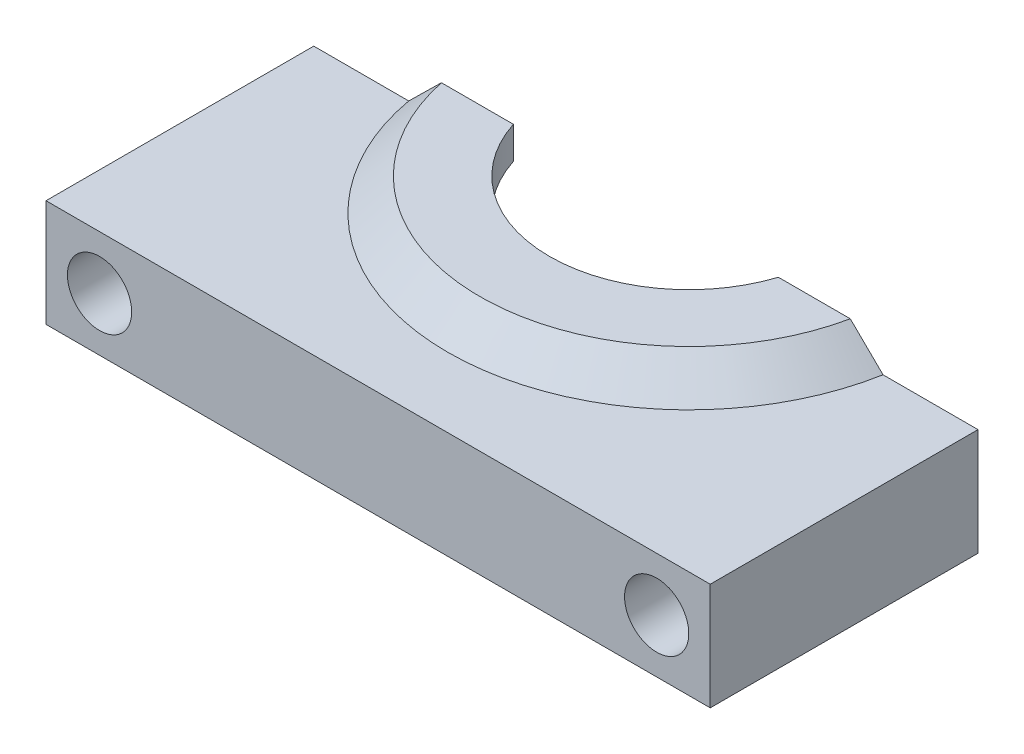
ISO-10303-21;
HEADER;
FILE_DESCRIPTION(('STEP AP214'),'2;1');
FILE_NAME('part.step','',(''),(''),'','','');
FILE_SCHEMA(('AUTOMOTIVE_DESIGN { 1 0 10303 214 1 1 1 1 }'));
ENDSEC;
DATA;
#1=APPLICATION_CONTEXT('core data for automotive mechanical design processes');
#2=APPLICATION_PROTOCOL_DEFINITION('international standard','automotive_design',2000,#1);
#3=PRODUCT_CONTEXT('',#1,'mechanical');
#4=PRODUCT('Part','Part','',(#3));
#5=PRODUCT_RELATED_PRODUCT_CATEGORY('part','',(#4));
#6=PRODUCT_DEFINITION_FORMATION('','',#4);
#7=PRODUCT_DEFINITION_CONTEXT('part definition',#1,'design');
#8=PRODUCT_DEFINITION('design','',#6,#7);
#9=PRODUCT_DEFINITION_SHAPE('','',#8);
#10=(LENGTH_UNIT() NAMED_UNIT(*) SI_UNIT(.MILLI.,.METRE.));
#11=(NAMED_UNIT(*) PLANE_ANGLE_UNIT() SI_UNIT($,.RADIAN.));
#12=(NAMED_UNIT(*) SI_UNIT($,.STERADIAN.) SOLID_ANGLE_UNIT());
#13=UNCERTAINTY_MEASURE_WITH_UNIT(LENGTH_MEASURE(1.E-05),#10,'distance_accuracy_value','');
#14=(GEOMETRIC_REPRESENTATION_CONTEXT(3) GLOBAL_UNCERTAINTY_ASSIGNED_CONTEXT((#13)) GLOBAL_UNIT_ASSIGNED_CONTEXT((#10,
#11,#12)) REPRESENTATION_CONTEXT('',''));
#15=CARTESIAN_POINT('',(0.,0.,0.));
#16=DIRECTION('',(0.,0.,1.));
#17=DIRECTION('',(1.,0.,0.));
#18=AXIS2_PLACEMENT_3D('',#15,#16,#17);
#19=CARTESIAN_POINT('',(31.0078105935821,10.,29.));
#20=DIRECTION('',(0.,0.,-1.));
#21=DIRECTION('',(-1.,0.,0.));
#22=AXIS2_PLACEMENT_3D('',#19,#20,#21);
#23=PLANE('',#22);
#24=CARTESIAN_POINT('',(26.0078105935821,5.,29.));
#25=DIRECTION('',(0.,0.,-1.));
#26=DIRECTION('',(-1.,0.,0.));
#27=AXIS2_PLACEMENT_3D('',#24,#25,#26);
#28=CIRCLE('',#27,3.);
#29=CARTESIAN_POINT('',(23.0078105935821,5.,29.));
#30=VERTEX_POINT('',#29);
#31=EDGE_CURVE('E186',#30,#30,#28,.T.);
#32=ORIENTED_EDGE('',*,*,#31,.T.);
#33=EDGE_LOOP('',(#32));
#34=FACE_BOUND('',#33,.T.);
#35=CARTESIAN_POINT('',(-26.0078105935821,5.,29.));
#36=DIRECTION('',(0.,0.,-1.));
#37=DIRECTION('',(-1.,0.,0.));
#38=AXIS2_PLACEMENT_3D('',#35,#36,#37);
#39=CIRCLE('',#38,3.);
#40=CARTESIAN_POINT('',(-29.0078105935821,5.,29.));
#41=VERTEX_POINT('',#40);
#42=EDGE_CURVE('E182',#41,#41,#39,.T.);
#43=ORIENTED_EDGE('',*,*,#42,.T.);
#44=EDGE_LOOP('',(#43));
#45=FACE_BOUND('',#44,.T.);
#46=DIRECTION('',(1.,0.,0.));
#47=VECTOR('',#46,1.);
#48=CARTESIAN_POINT('',(31.0078105935821,0.,29.));
#49=LINE('',#48,#47);
#50=CARTESIAN_POINT('',(-31.0078105935821,0.,29.));
#51=VERTEX_POINT('',#50);
#52=CARTESIAN_POINT('',(31.0078105935821,0.,29.));
#53=VERTEX_POINT('',#52);
#54=EDGE_CURVE('E189',#51,#53,#49,.T.);
#55=ORIENTED_EDGE('',*,*,#54,.T.);
#56=DIRECTION('',(0.,-1.,0.));
#57=VECTOR('',#56,1.);
#58=CARTESIAN_POINT('',(31.0078105935821,10.,29.));
#59=LINE('',#58,#57);
#60=CARTESIAN_POINT('',(31.0078105935821,10.,29.));
#61=VERTEX_POINT('',#60);
#62=EDGE_CURVE('E230',#61,#53,#59,.T.);
#63=ORIENTED_EDGE('',*,*,#62,.F.);
#64=DIRECTION('',(1.,0.,0.));
#65=VECTOR('',#64,1.);
#66=CARTESIAN_POINT('',(-31.0078105935821,10.,29.));
#67=LINE('',#66,#65);
#68=CARTESIAN_POINT('',(-31.0078105935821,10.,29.));
#69=VERTEX_POINT('',#68);
#70=EDGE_CURVE('E190',#69,#61,#67,.T.);
#71=ORIENTED_EDGE('',*,*,#70,.F.);
#72=DIRECTION('',(0.,-1.,0.));
#73=VECTOR('',#72,1.);
#74=CARTESIAN_POINT('',(-31.0078105935821,10.,29.));
#75=LINE('',#74,#73);
#76=EDGE_CURVE('E204',#69,#51,#75,.T.);
#77=ORIENTED_EDGE('',*,*,#76,.T.);
#78=EDGE_LOOP('',(#55,#63,#71,#77));
#79=FACE_BOUND('',#78,.T.);
#80=ADVANCED_FACE('F34',(#34,#45,#79),#23,.F.);
#81=CARTESIAN_POINT('',(31.0078105935821,10.,3.99999999999999));
#82=DIRECTION('',(-1.,0.,0.));
#83=DIRECTION('',(0.,0.,1.));
#84=AXIS2_PLACEMENT_3D('',#81,#82,#83);
#85=PLANE('',#84);
#86=DIRECTION('',(0.,0.,-1.));
#87=VECTOR('',#86,1.);
#88=CARTESIAN_POINT('',(31.0078105935821,0.,3.99999999999999));
#89=LINE('',#88,#87);
#90=CARTESIAN_POINT('',(31.0078105935821,0.,3.99999999999999));
#91=VERTEX_POINT('',#90);
#92=EDGE_CURVE('E206',#53,#91,#89,.T.);
#93=ORIENTED_EDGE('',*,*,#92,.T.);
#94=DIRECTION('',(0.,-1.,0.));
#95=VECTOR('',#94,1.);
#96=CARTESIAN_POINT('',(31.0078105935821,10.,3.99999999999999));
#97=LINE('',#96,#95);
#98=CARTESIAN_POINT('',(31.0078105935821,10.,3.99999999999999));
#99=VERTEX_POINT('',#98);
#100=EDGE_CURVE('E227',#99,#91,#97,.T.);
#101=ORIENTED_EDGE('',*,*,#100,.F.);
#102=DIRECTION('',(0.,0.,-1.));
#103=VECTOR('',#102,1.);
#104=CARTESIAN_POINT('',(31.0078105935821,10.,3.99999999999999));
#105=LINE('',#104,#103);
#106=EDGE_CURVE('E192',#61,#99,#105,.T.);
#107=ORIENTED_EDGE('',*,*,#106,.F.);
#108=ORIENTED_EDGE('',*,*,#62,.T.);
#109=EDGE_LOOP('',(#93,#101,#107,#108));
#110=FACE_BOUND('',#109,.T.);
#111=ADVANCED_FACE('F277',(#110),#85,.F.);
#112=CARTESIAN_POINT('',(16.3065661621324,10.,3.99999999999999));
#113=DIRECTION('',(0.,0.,1.));
#114=DIRECTION('',(1.,0.,0.));
#115=AXIS2_PLACEMENT_3D('',#112,#113,#114);
#116=PLANE('',#115);
#117=DIRECTION('',(1.,0.,0.));
#118=VECTOR('',#117,1.);
#119=CARTESIAN_POINT('',(-19.0853346839923,13.,4.));
#120=LINE('',#119,#118);
#121=CARTESIAN_POINT('',(12.369316876853,13.,3.99999999999999));
#122=VERTEX_POINT('',#121);
#123=CARTESIAN_POINT('',(19.0853346839923,13.,3.99999999999999));
#124=VERTEX_POINT('',#123);
#125=EDGE_CURVE('E168',#122,#124,#120,.T.);
#126=ORIENTED_EDGE('',*,*,#125,.T.);
#127=CARTESIAN_POINT('',(19.0853346839923,13.,3.99999999999999));
#128=CARTESIAN_POINT('',(19.3403863964678,12.7503708283375,3.99999999999999));
#129=CARTESIAN_POINT('',(19.5953339559794,12.5006352757306,3.99999999999999));
#130=CARTESIAN_POINT('',(20.1050409853264,12.0009725280335,3.99999999999999));
#131=CARTESIAN_POINT('',(20.3598004552478,11.7510453330311,3.99999999999999));
#132=CARTESIAN_POINT('',(20.8691517322347,11.2510202138494,3.99999999999999));
#133=CARTESIAN_POINT('',(21.1237435393153,11.0009222896855,3.99999999999999));
#134=CARTESIAN_POINT('',(21.6327759921179,10.5005724205722,3.99999999999999));
#135=CARTESIAN_POINT('',(21.8872166377706,10.2503204755525,3.99999999999999));
#136=CARTESIAN_POINT('',(22.1415898254845,10.,3.99999999999999));
#137=B_SPLINE_CURVE_WITH_KNOTS('',3,(#127,#128,#129,#130,#131,#132,#133,#134,#135,#136),
.UNSPECIFIED.,.F.,.F.,(4,2,2,2,4),(0.,1.07065155566746,2.14130262110405,3.21195359001414,
4.28260504880375),.UNSPECIFIED.);
#138=CARTESIAN_POINT('',(22.1415898254845,10.,3.99999999999999));
#139=VERTEX_POINT('',#138);
#140=EDGE_CURVE('E157',#124,#139,#137,.T.);
#141=ORIENTED_EDGE('',*,*,#140,.T.);
#142=DIRECTION('',(-1.,0.,0.));
#143=VECTOR('',#142,1.);
#144=CARTESIAN_POINT('',(16.3065661621324,10.,3.99999999999999));
#145=LINE('',#144,#143);
#146=EDGE_CURVE('E195',#99,#139,#145,.T.);
#147=ORIENTED_EDGE('',*,*,#146,.F.);
#148=ORIENTED_EDGE('',*,*,#100,.T.);
#149=DIRECTION('',(-1.,0.,0.));
#150=VECTOR('',#149,1.);
#151=CARTESIAN_POINT('',(16.3065661621324,0.,3.99999999999999));
#152=LINE('',#151,#150);
#153=CARTESIAN_POINT('',(16.3065661621324,0.,3.99999999999999));
#154=VERTEX_POINT('',#153);
#155=EDGE_CURVE('E208',#91,#154,#152,.T.);
#156=ORIENTED_EDGE('',*,*,#155,.T.);
#157=DIRECTION('',(0.,-1.,0.));
#158=VECTOR('',#157,1.);
#159=CARTESIAN_POINT('',(16.3065661621324,10.,3.99999999999999));
#160=LINE('',#159,#158);
#161=CARTESIAN_POINT('',(16.3065661621324,10.,3.99999999999999));
#162=VERTEX_POINT('',#161);
#163=EDGE_CURVE('E225',#162,#154,#160,.T.);
#164=ORIENTED_EDGE('',*,*,#163,.F.);
#165=DIRECTION('',(1.,0.,0.));
#166=VECTOR('',#165,1.);
#167=CARTESIAN_POINT('',(0.,10.,3.99999999999999));
#168=LINE('',#167,#166);
#169=CARTESIAN_POINT('',(12.369316876853,10.,3.99999999999999));
#170=VERTEX_POINT('',#169);
#171=EDGE_CURVE('E167',#170,#162,#168,.T.);
#172=ORIENTED_EDGE('',*,*,#171,.F.);
#173=DIRECTION('',(0.,-1.,0.));
#174=VECTOR('',#173,1.);
#175=CARTESIAN_POINT('',(12.369316876853,13.,3.99999999999999));
#176=LINE('',#175,#174);
#177=EDGE_CURVE('E233',#170,#122,#176,.F.);
#178=ORIENTED_EDGE('',*,*,#177,.T.);
#179=EDGE_LOOP('',(#126,#141,#147,#148,#156,#164,#172,#178));
#180=FACE_BOUND('',#179,.T.);
#181=CARTESIAN_POINT('',(26.0078105935821,5.,3.99999999999999));
#182=DIRECTION('',(0.,0.,-1.));
#183=DIRECTION('',(-1.,0.,0.));
#184=AXIS2_PLACEMENT_3D('',#181,#182,#183);
#185=CIRCLE('',#184,3.);
#186=CARTESIAN_POINT('',(23.0078105935821,5.,3.99999999999999));
#187=VERTEX_POINT('',#186);
#188=EDGE_CURVE('E175',#187,#187,#185,.T.);
#189=ORIENTED_EDGE('',*,*,#188,.F.);
#190=EDGE_LOOP('',(#189));
#191=FACE_BOUND('',#190,.T.);
#192=ADVANCED_FACE('F249',(#180,#191),#116,.F.);
#193=CARTESIAN_POINT('',(0.,10.,0.));
#194=DIRECTION('',(0.,-1.,0.));
#195=DIRECTION('',(0.,0.,-1.));
#196=AXIS2_PLACEMENT_3D('',#193,#194,#195);
#197=CYLINDRICAL_SURFACE('',#196,16.79);
#198=CARTESIAN_POINT('',(0.,0.,0.));
#199=DIRECTION('',(0.,-1.,0.));
#200=DIRECTION('',(0.,0.,1.));
#201=AXIS2_PLACEMENT_3D('',#198,#199,#200);
#202=CIRCLE('',#201,16.79);
#203=CARTESIAN_POINT('',(-16.3065661621324,0.,4.));
#204=VERTEX_POINT('',#203);
#205=EDGE_CURVE('E211',#154,#204,#202,.T.);
#206=ORIENTED_EDGE('',*,*,#205,.T.);
#207=DIRECTION('',(0.,-1.,0.));
#208=VECTOR('',#207,1.);
#209=CARTESIAN_POINT('',(-16.3065661621324,10.,4.));
#210=LINE('',#209,#208);
#211=CARTESIAN_POINT('',(-16.3065661621324,10.,4.));
#212=VERTEX_POINT('',#211);
#213=EDGE_CURVE('E223',#212,#204,#210,.T.);
#214=ORIENTED_EDGE('',*,*,#213,.F.);
#215=CARTESIAN_POINT('',(0.,10.,0.));
#216=DIRECTION('',(0.,-1.,0.));
#217=DIRECTION('',(0.,0.,1.));
#218=AXIS2_PLACEMENT_3D('',#215,#216,#217);
#219=CIRCLE('',#218,16.79);
#220=EDGE_CURVE('E198',#162,#212,#219,.T.);
#221=ORIENTED_EDGE('',*,*,#220,.F.);
#222=ORIENTED_EDGE('',*,*,#163,.T.);
#223=EDGE_LOOP('',(#206,#214,#221,#222));
#224=FACE_BOUND('',#223,.T.);
#225=ADVANCED_FACE('F313',(#224),#197,.F.);
#226=CARTESIAN_POINT('',(-16.3065661621324,10.,4.));
#227=DIRECTION('',(0.,0.,1.));
#228=DIRECTION('',(1.,0.,0.));
#229=AXIS2_PLACEMENT_3D('',#226,#227,#228);
#230=PLANE('',#229);
#231=CARTESIAN_POINT('',(-26.0078105935821,5.,4.));
#232=DIRECTION('',(0.,0.,-1.));
#233=DIRECTION('',(-1.,0.,0.));
#234=AXIS2_PLACEMENT_3D('',#231,#232,#233);
#235=CIRCLE('',#234,3.);
#236=CARTESIAN_POINT('',(-29.0078105935821,5.,4.));
#237=VERTEX_POINT('',#236);
#238=EDGE_CURVE('E172',#237,#237,#235,.T.);
#239=ORIENTED_EDGE('',*,*,#238,.F.);
#240=EDGE_LOOP('',(#239));
#241=FACE_BOUND('',#240,.T.);
#242=DIRECTION('',(0.,-1.,0.));
#243=VECTOR('',#242,1.);
#244=CARTESIAN_POINT('',(-31.0078105935821,10.,4.));
#245=LINE('',#244,#243);
#246=CARTESIAN_POINT('',(-31.0078105935821,10.,4.));
#247=VERTEX_POINT('',#246);
#248=CARTESIAN_POINT('',(-31.0078105935821,0.,4.));
#249=VERTEX_POINT('',#248);
#250=EDGE_CURVE('E220',#247,#249,#245,.T.);
#251=ORIENTED_EDGE('',*,*,#250,.F.);
#252=DIRECTION('',(-1.,0.,0.));
#253=VECTOR('',#252,1.);
#254=CARTESIAN_POINT('',(-16.3065661621324,10.,4.));
#255=LINE('',#254,#253);
#256=CARTESIAN_POINT('',(-22.1415898254845,10.,4.));
#257=VERTEX_POINT('',#256);
#258=EDGE_CURVE('E152',#257,#247,#255,.T.);
#259=ORIENTED_EDGE('',*,*,#258,.F.);
#260=CARTESIAN_POINT('',(-22.1415898254845,10.,4.));
#261=CARTESIAN_POINT('',(-21.8872166377706,10.2503204755525,4.));
#262=CARTESIAN_POINT('',(-21.6327759921179,10.5005724205722,4.));
#263=CARTESIAN_POINT('',(-21.1237435393153,11.0009222896855,4.));
#264=CARTESIAN_POINT('',(-20.8691517322347,11.2510202138494,4.));
#265=CARTESIAN_POINT('',(-20.3598004552478,11.7510453330311,4.));
#266=CARTESIAN_POINT('',(-20.1050409853264,12.0009725280335,4.));
#267=CARTESIAN_POINT('',(-19.5953339559794,12.5006352757306,4.));
#268=CARTESIAN_POINT('',(-19.3403863964678,12.7503708283375,4.));
#269=CARTESIAN_POINT('',(-19.0853346839923,13.,4.));
#270=B_SPLINE_CURVE_WITH_KNOTS('',3,(#260,#261,#262,#263,#264,#265,#266,#267,#268,#269),
.UNSPECIFIED.,.F.,.F.,(4,2,2,2,4),(0.,1.07065145878961,2.14130242769971,3.2119534931363,
4.28260504880375),.UNSPECIFIED.);
#271=CARTESIAN_POINT('',(-19.0853346839923,13.,4.));
#272=VERTEX_POINT('',#271);
#273=EDGE_CURVE('E146',#257,#272,#270,.T.);
#274=ORIENTED_EDGE('',*,*,#273,.T.);
#275=CARTESIAN_POINT('',(-12.369316876853,13.,4.));
#276=VERTEX_POINT('',#275);
#277=EDGE_CURVE('E150',#272,#276,#120,.T.);
#278=ORIENTED_EDGE('',*,*,#277,.T.);
#279=DIRECTION('',(0.,-1.,0.));
#280=VECTOR('',#279,1.);
#281=CARTESIAN_POINT('',(-12.369316876853,13.,4.));
#282=LINE('',#281,#280);
#283=CARTESIAN_POINT('',(-12.369316876853,10.,4.));
#284=VERTEX_POINT('',#283);
#285=EDGE_CURVE('E235',#276,#284,#282,.T.);
#286=ORIENTED_EDGE('',*,*,#285,.T.);
#287=EDGE_CURVE('E311',#212,#284,#168,.T.);
#288=ORIENTED_EDGE('',*,*,#287,.F.);
#289=ORIENTED_EDGE('',*,*,#213,.T.);
#290=DIRECTION('',(-1.,0.,0.));
#291=VECTOR('',#290,1.);
#292=CARTESIAN_POINT('',(-16.3065661621324,0.,4.));
#293=LINE('',#292,#291);
#294=EDGE_CURVE('E214',#204,#249,#293,.T.);
#295=ORIENTED_EDGE('',*,*,#294,.T.);
#296=EDGE_LOOP('',(#251,#259,#274,#278,#286,#288,#289,#295));
#297=FACE_BOUND('',#296,.T.);
#298=ADVANCED_FACE('F149',(#241,#297),#230,.F.);
#299=CARTESIAN_POINT('',(-31.0078105935821,10.,4.));
#300=DIRECTION('',(1.,0.,0.));
#301=DIRECTION('',(0.,0.,-1.));
#302=AXIS2_PLACEMENT_3D('',#299,#300,#301);
#303=PLANE('',#302);
#304=DIRECTION('',(0.,0.,1.));
#305=VECTOR('',#304,1.);
#306=CARTESIAN_POINT('',(-31.0078105935821,0.,4.));
#307=LINE('',#306,#305);
#308=EDGE_CURVE('E193',#249,#51,#307,.T.);
#309=ORIENTED_EDGE('',*,*,#308,.T.);
#310=ORIENTED_EDGE('',*,*,#76,.F.);
#311=DIRECTION('',(0.,0.,1.));
#312=VECTOR('',#311,1.);
#313=CARTESIAN_POINT('',(-31.0078105935821,10.,4.));
#314=LINE('',#313,#312);
#315=EDGE_CURVE('E202',#247,#69,#314,.T.);
#316=ORIENTED_EDGE('',*,*,#315,.F.);
#317=ORIENTED_EDGE('',*,*,#250,.T.);
#318=EDGE_LOOP('',(#309,#310,#316,#317));
#319=FACE_BOUND('',#318,.T.);
#320=ADVANCED_FACE('F308',(#319),#303,.F.);
#321=CARTESIAN_POINT('',(0.,10.,0.));
#322=DIRECTION('',(0.,1.,0.));
#323=DIRECTION('',(0.,0.,1.));
#324=AXIS2_PLACEMENT_3D('',#321,#322,#323);
#325=PLANE('',#324);
#326=ORIENTED_EDGE('',*,*,#146,.T.);
#327=CARTESIAN_POINT('',(0.,10.,0.));
#328=DIRECTION('',(0.,1.,0.));
#329=DIRECTION('',(0.,0.,1.));
#330=AXIS2_PLACEMENT_3D('',#327,#328,#329);
#331=CIRCLE('',#330,22.5);
#332=EDGE_CURVE('E237',#139,#257,#331,.F.);
#333=ORIENTED_EDGE('',*,*,#332,.T.);
#334=ORIENTED_EDGE('',*,*,#258,.T.);
#335=ORIENTED_EDGE('',*,*,#315,.T.);
#336=ORIENTED_EDGE('',*,*,#70,.T.);
#337=ORIENTED_EDGE('',*,*,#106,.T.);
#338=EDGE_LOOP('',(#326,#333,#334,#335,#336,#337));
#339=FACE_BOUND('',#338,.T.);
#340=ADVANCED_FACE('F305',(#339),#325,.T.);
#341=CARTESIAN_POINT('',(0.,0.,0.));
#342=DIRECTION('',(0.,1.,0.));
#343=DIRECTION('',(0.,0.,1.));
#344=AXIS2_PLACEMENT_3D('',#341,#342,#343);
#345=PLANE('',#344);
#346=CARTESIAN_POINT('',(17.0680673789464,0.,22.8091253821038));
#347=DIRECTION('',(0.,1.,0.));
#348=DIRECTION('',(0.,0.,1.));
#349=AXIS2_PLACEMENT_3D('',#346,#347,#348);
#350=CIRCLE('',#349,3.65);
#351=CARTESIAN_POINT('',(17.0680673789464,0.,26.4591253821038));
#352=VERTEX_POINT('',#351);
#353=CARTESIAN_POINT('',(20.7170570404831,0.,22.895));
#354=VERTEX_POINT('',#353);
#355=EDGE_CURVE('E43',#352,#354,#350,.T.);
#356=ORIENTED_EDGE('',*,*,#355,.T.);
#357=CARTESIAN_POINT('',(17.0680673789464,0.,22.9808746178962));
#358=DIRECTION('',(0.,1.,0.));
#359=DIRECTION('',(0.,0.,1.));
#360=AXIS2_PLACEMENT_3D('',#357,#358,#359);
#361=CIRCLE('',#360,3.65);
#362=CARTESIAN_POINT('',(17.0680673789464,0.,19.3308746178962));
#363=VERTEX_POINT('',#362);
#364=EDGE_CURVE('E11',#354,#363,#361,.T.);
#365=ORIENTED_EDGE('',*,*,#364,.T.);
#366=DIRECTION('',(1.,0.,0.));
#367=VECTOR('',#366,1.);
#368=CARTESIAN_POINT('',(-20.7180673789464,0.,19.3308746178962));
#369=LINE('',#368,#367);
#370=CARTESIAN_POINT('',(-17.0680673789464,0.,19.3308746178962));
#371=VERTEX_POINT('',#370);
#372=EDGE_CURVE('E322',#371,#363,#369,.T.);
#373=ORIENTED_EDGE('',*,*,#372,.F.);
#374=CARTESIAN_POINT('',(-17.0680673789464,0.,22.9808746178962));
#375=DIRECTION('',(0.,1.,0.));
#376=DIRECTION('',(0.,0.,1.));
#377=AXIS2_PLACEMENT_3D('',#374,#375,#376);
#378=CIRCLE('',#377,3.65);
#379=CARTESIAN_POINT('',(-20.7170570404831,0.,22.895));
#380=VERTEX_POINT('',#379);
#381=EDGE_CURVE('E56',#371,#380,#378,.T.);
#382=ORIENTED_EDGE('',*,*,#381,.T.);
#383=CARTESIAN_POINT('',(-17.0680673789464,0.,22.8091253821038));
#384=DIRECTION('',(0.,1.,0.));
#385=DIRECTION('',(0.,0.,1.));
#386=AXIS2_PLACEMENT_3D('',#383,#384,#385);
#387=CIRCLE('',#386,3.65);
#388=CARTESIAN_POINT('',(-17.0680673789464,0.,26.4591253821038));
#389=VERTEX_POINT('',#388);
#390=EDGE_CURVE('E357',#380,#389,#387,.T.);
#391=ORIENTED_EDGE('',*,*,#390,.T.);
#392=DIRECTION('',(-1.,0.,0.));
#393=VECTOR('',#392,1.);
#394=CARTESIAN_POINT('',(-20.7180673789464,0.,26.4591253821038));
#395=LINE('',#394,#393);
#396=EDGE_CURVE('E326',#352,#389,#395,.T.);
#397=ORIENTED_EDGE('',*,*,#396,.F.);
#398=EDGE_LOOP('',(#356,#365,#373,#382,#391,#397));
#399=FACE_BOUND('',#398,.T.);
#400=ORIENTED_EDGE('',*,*,#54,.F.);
#401=ORIENTED_EDGE('',*,*,#308,.F.);
#402=ORIENTED_EDGE('',*,*,#294,.F.);
#403=ORIENTED_EDGE('',*,*,#205,.F.);
#404=ORIENTED_EDGE('',*,*,#155,.F.);
#405=ORIENTED_EDGE('',*,*,#92,.F.);
#406=EDGE_LOOP('',(#400,#401,#402,#403,#404,#405));
#407=FACE_BOUND('',#406,.T.);
#408=ADVANCED_FACE('F296',(#399,#407),#345,.F.);
#409=CARTESIAN_POINT('',(-26.0078105935821,5.,31.));
#410=DIRECTION('',(0.,0.,-1.));
#411=DIRECTION('',(-1.,0.,0.));
#412=AXIS2_PLACEMENT_3D('',#409,#410,#411);
#413=CYLINDRICAL_SURFACE('',#412,3.);
#414=ORIENTED_EDGE('',*,*,#238,.T.);
#415=EDGE_LOOP('',(#414));
#416=FACE_BOUND('',#415,.T.);
#417=ORIENTED_EDGE('',*,*,#42,.F.);
#418=EDGE_LOOP('',(#417));
#419=FACE_BOUND('',#418,.T.);
#420=ADVANCED_FACE('F388',(#416,#419),#413,.F.);
#421=CARTESIAN_POINT('',(26.0078105935821,5.,31.));
#422=DIRECTION('',(0.,0.,-1.));
#423=DIRECTION('',(-1.,0.,0.));
#424=AXIS2_PLACEMENT_3D('',#421,#422,#423);
#425=CYLINDRICAL_SURFACE('',#424,3.);
#426=ORIENTED_EDGE('',*,*,#188,.T.);
#427=EDGE_LOOP('',(#426));
#428=FACE_BOUND('',#427,.T.);
#429=ORIENTED_EDGE('',*,*,#31,.F.);
#430=EDGE_LOOP('',(#429));
#431=FACE_BOUND('',#430,.T.);
#432=ADVANCED_FACE('F385',(#428,#431),#425,.F.);
#433=CARTESIAN_POINT('',(0.,10.,0.));
#434=DIRECTION('',(0.,1.,0.));
#435=DIRECTION('',(0.,0.,1.));
#436=AXIS2_PLACEMENT_3D('',#433,#434,#435);
#437=PLANE('',#436);
#438=ORIENTED_EDGE('',*,*,#220,.T.);
#439=ORIENTED_EDGE('',*,*,#287,.T.);
#440=CARTESIAN_POINT('',(0.,10.,0.));
#441=DIRECTION('',(0.,1.,0.));
#442=DIRECTION('',(0.,0.,1.));
#443=AXIS2_PLACEMENT_3D('',#440,#441,#442);
#444=CIRCLE('',#443,13.);
#445=EDGE_CURVE('E177',#284,#170,#444,.T.);
#446=ORIENTED_EDGE('',*,*,#445,.T.);
#447=ORIENTED_EDGE('',*,*,#171,.T.);
#448=EDGE_LOOP('',(#438,#439,#446,#447));
#449=FACE_BOUND('',#448,.T.);
#450=ADVANCED_FACE('F315',(#449),#437,.F.);
#451=CARTESIAN_POINT('',(0.,13.,0.));
#452=DIRECTION('',(0.,1.,0.));
#453=DIRECTION('',(0.,0.,1.));
#454=AXIS2_PLACEMENT_3D('',#451,#452,#453);
#455=PLANE('',#454);
#456=ORIENTED_EDGE('',*,*,#277,.F.);
#457=CARTESIAN_POINT('',(0.,13.,0.));
#458=DIRECTION('',(0.,1.,0.));
#459=DIRECTION('',(0.,0.,1.));
#460=AXIS2_PLACEMENT_3D('',#457,#458,#459);
#461=CIRCLE('',#460,19.5);
#462=EDGE_CURVE('E164',#272,#124,#461,.T.);
#463=ORIENTED_EDGE('',*,*,#462,.T.);
#464=ORIENTED_EDGE('',*,*,#125,.F.);
#465=CARTESIAN_POINT('',(0.,13.,0.));
#466=DIRECTION('',(0.,1.,0.));
#467=DIRECTION('',(0.,0.,1.));
#468=AXIS2_PLACEMENT_3D('',#465,#466,#467);
#469=CIRCLE('',#468,13.);
#470=EDGE_CURVE('E166',#276,#122,#469,.T.);
#471=ORIENTED_EDGE('',*,*,#470,.F.);
#472=EDGE_LOOP('',(#456,#463,#464,#471));
#473=FACE_BOUND('',#472,.T.);
#474=ADVANCED_FACE('F162',(#473),#455,.T.);
#475=CARTESIAN_POINT('',(0.,13.,0.));
#476=DIRECTION('',(0.,-1.,0.));
#477=DIRECTION('',(0.,0.,-1.));
#478=AXIS2_PLACEMENT_3D('',#475,#476,#477);
#479=CYLINDRICAL_SURFACE('',#478,13.);
#480=ORIENTED_EDGE('',*,*,#285,.F.);
#481=ORIENTED_EDGE('',*,*,#470,.T.);
#482=ORIENTED_EDGE('',*,*,#177,.F.);
#483=ORIENTED_EDGE('',*,*,#445,.F.);
#484=EDGE_LOOP('',(#480,#481,#482,#483));
#485=FACE_BOUND('',#484,.T.);
#486=ADVANCED_FACE('F258',(#485),#479,.F.);
#487=CARTESIAN_POINT('',(0.,13.,0.));
#488=DIRECTION('',(0.,-1.,0.));
#489=DIRECTION('',(0.,0.,-1.));
#490=AXIS2_PLACEMENT_3D('',#487,#488,#489);
#491=CONICAL_SURFACE('',#490,19.5,0.785398163397443);
#492=ORIENTED_EDGE('',*,*,#273,.F.);
#493=ORIENTED_EDGE('',*,*,#332,.F.);
#494=ORIENTED_EDGE('',*,*,#140,.F.);
#495=ORIENTED_EDGE('',*,*,#462,.F.);
#496=EDGE_LOOP('',(#492,#493,#494,#495));
#497=FACE_BOUND('',#496,.T.);
#498=ADVANCED_FACE('F170',(#497),#491,.T.);
#499=CARTESIAN_POINT('',(-20.7180673789464,5.,19.3308746178962));
#500=DIRECTION('',(0.,0.,-1.));
#501=DIRECTION('',(-1.,0.,0.));
#502=AXIS2_PLACEMENT_3D('',#499,#500,#501);
#503=PLANE('',#502);
#504=DIRECTION('',(1.,0.,0.));
#505=VECTOR('',#504,1.);
#506=CARTESIAN_POINT('',(-20.7180673789464,5.,19.3308746178962));
#507=LINE('',#506,#505);
#508=CARTESIAN_POINT('',(-17.0680673789464,5.,19.3308746178962));
#509=VERTEX_POINT('',#508);
#510=CARTESIAN_POINT('',(17.0680673789464,5.,19.3308746178962));
#511=VERTEX_POINT('',#510);
#512=EDGE_CURVE('E321',#509,#511,#507,.T.);
#513=ORIENTED_EDGE('',*,*,#512,.F.);
#514=DIRECTION('',(0.,-1.,0.));
#515=VECTOR('',#514,1.);
#516=CARTESIAN_POINT('',(-17.0680673789464,0.,19.3308746178962));
#517=LINE('',#516,#515);
#518=EDGE_CURVE('E367',#509,#371,#517,.T.);
#519=ORIENTED_EDGE('',*,*,#518,.T.);
#520=ORIENTED_EDGE('',*,*,#372,.T.);
#521=DIRECTION('',(0.,-1.,0.));
#522=VECTOR('',#521,1.);
#523=CARTESIAN_POINT('',(17.0680673789464,5.,19.3308746178962));
#524=LINE('',#523,#522);
#525=EDGE_CURVE('E156',#363,#511,#524,.F.);
#526=ORIENTED_EDGE('',*,*,#525,.T.);
#527=EDGE_LOOP('',(#513,#519,#520,#526));
#528=FACE_BOUND('',#527,.T.);
#529=ADVANCED_FACE('F257',(#528),#503,.F.);
#530=CARTESIAN_POINT('',(-20.7180673789464,5.,26.4591253821038));
#531=DIRECTION('',(0.,0.,1.));
#532=DIRECTION('',(1.,0.,0.));
#533=AXIS2_PLACEMENT_3D('',#530,#531,#532);
#534=PLANE('',#533);
#535=ORIENTED_EDGE('',*,*,#396,.T.);
#536=DIRECTION('',(0.,-1.,0.));
#537=VECTOR('',#536,1.);
#538=CARTESIAN_POINT('',(-17.0680673789464,5.,26.4591253821038));
#539=LINE('',#538,#537);
#540=CARTESIAN_POINT('',(-17.0680673789464,5.,26.4591253821038));
#541=VERTEX_POINT('',#540);
#542=EDGE_CURVE('E343',#389,#541,#539,.F.);
#543=ORIENTED_EDGE('',*,*,#542,.T.);
#544=DIRECTION('',(-1.,0.,0.));
#545=VECTOR('',#544,1.);
#546=CARTESIAN_POINT('',(-20.7180673789464,5.,26.4591253821038));
#547=LINE('',#546,#545);
#548=CARTESIAN_POINT('',(17.0680673789464,5.,26.4591253821038));
#549=VERTEX_POINT('',#548);
#550=EDGE_CURVE('E325',#549,#541,#547,.T.);
#551=ORIENTED_EDGE('',*,*,#550,.F.);
#552=DIRECTION('',(0.,-1.,0.));
#553=VECTOR('',#552,1.);
#554=CARTESIAN_POINT('',(17.0680673789464,0.,26.4591253821038));
#555=LINE('',#554,#553);
#556=EDGE_CURVE('E348',#549,#352,#555,.T.);
#557=ORIENTED_EDGE('',*,*,#556,.T.);
#558=EDGE_LOOP('',(#535,#543,#551,#557));
#559=FACE_BOUND('',#558,.T.);
#560=ADVANCED_FACE('F370',(#559),#534,.F.);
#561=CARTESIAN_POINT('',(0.,5.,0.));
#562=DIRECTION('',(0.,1.,0.));
#563=DIRECTION('',(0.,0.,1.));
#564=AXIS2_PLACEMENT_3D('',#561,#562,#563);
#565=PLANE('',#564);
#566=CARTESIAN_POINT('',(-17.0680673789464,5.,22.8091253821038));
#567=DIRECTION('',(0.,1.,0.));
#568=DIRECTION('',(0.,0.,1.));
#569=AXIS2_PLACEMENT_3D('',#566,#567,#568);
#570=CIRCLE('',#569,3.65);
#571=CARTESIAN_POINT('',(-20.7170570404831,5.,22.895));
#572=VERTEX_POINT('',#571);
#573=EDGE_CURVE('E336',#541,#572,#570,.F.);
#574=ORIENTED_EDGE('',*,*,#573,.T.);
#575=CARTESIAN_POINT('',(-17.0680673789464,5.,22.9808746178962));
#576=DIRECTION('',(0.,1.,0.));
#577=DIRECTION('',(0.,0.,1.));
#578=AXIS2_PLACEMENT_3D('',#575,#576,#577);
#579=CIRCLE('',#578,3.65);
#580=EDGE_CURVE('E346',#572,#509,#579,.F.);
#581=ORIENTED_EDGE('',*,*,#580,.T.);
#582=ORIENTED_EDGE('',*,*,#512,.T.);
#583=CARTESIAN_POINT('',(17.0680673789464,5.,22.9808746178962));
#584=DIRECTION('',(0.,1.,0.));
#585=DIRECTION('',(0.,0.,1.));
#586=AXIS2_PLACEMENT_3D('',#583,#584,#585);
#587=CIRCLE('',#586,3.65);
#588=CARTESIAN_POINT('',(20.7170570404831,5.,22.895));
#589=VERTEX_POINT('',#588);
#590=EDGE_CURVE('E350',#511,#589,#587,.F.);
#591=ORIENTED_EDGE('',*,*,#590,.T.);
#592=CARTESIAN_POINT('',(17.0680673789464,5.,22.8091253821038));
#593=DIRECTION('',(0.,1.,0.));
#594=DIRECTION('',(0.,0.,1.));
#595=AXIS2_PLACEMENT_3D('',#592,#593,#594);
#596=CIRCLE('',#595,3.65);
#597=EDGE_CURVE('E338',#589,#549,#596,.F.);
#598=ORIENTED_EDGE('',*,*,#597,.T.);
#599=ORIENTED_EDGE('',*,*,#550,.T.);
#600=EDGE_LOOP('',(#574,#581,#582,#591,#598,#599));
#601=FACE_BOUND('',#600,.T.);
#602=ADVANCED_FACE('F266',(#601),#565,.F.);
#603=CARTESIAN_POINT('',(-17.0680673789464,5.,22.8091253821038));
#604=DIRECTION('',(0.,1.,0.));
#605=DIRECTION('',(0.,0.,1.));
#606=AXIS2_PLACEMENT_3D('',#603,#604,#605);
#607=CYLINDRICAL_SURFACE('',#606,3.65);
#608=DIRECTION('',(0.,1.,0.));
#609=VECTOR('',#608,1.);
#610=CARTESIAN_POINT('',(-20.7170570404831,2.5,22.895));
#611=LINE('',#610,#609);
#612=EDGE_CURVE('E329',#572,#380,#611,.F.);
#613=ORIENTED_EDGE('',*,*,#612,.F.);
#614=ORIENTED_EDGE('',*,*,#573,.F.);
#615=ORIENTED_EDGE('',*,*,#542,.F.);
#616=ORIENTED_EDGE('',*,*,#390,.F.);
#617=EDGE_LOOP('',(#613,#614,#615,#616));
#618=FACE_BOUND('',#617,.T.);
#619=ADVANCED_FACE('F263',(#618),#607,.F.);
#620=CARTESIAN_POINT('',(-17.0680673789464,5.,22.9808746178962));
#621=DIRECTION('',(0.,1.,0.));
#622=DIRECTION('',(0.,0.,1.));
#623=AXIS2_PLACEMENT_3D('',#620,#621,#622);
#624=CYLINDRICAL_SURFACE('',#623,3.65);
#625=ORIENTED_EDGE('',*,*,#580,.F.);
#626=ORIENTED_EDGE('',*,*,#612,.T.);
#627=ORIENTED_EDGE('',*,*,#381,.F.);
#628=ORIENTED_EDGE('',*,*,#518,.F.);
#629=EDGE_LOOP('',(#625,#626,#627,#628));
#630=FACE_BOUND('',#629,.T.);
#631=ADVANCED_FACE('F259',(#630),#624,.F.);
#632=CARTESIAN_POINT('',(17.0680673789464,5.,22.9808746178962));
#633=DIRECTION('',(0.,1.,0.));
#634=DIRECTION('',(0.,0.,1.));
#635=AXIS2_PLACEMENT_3D('',#632,#633,#634);
#636=CYLINDRICAL_SURFACE('',#635,3.65);
#637=DIRECTION('',(0.,1.,0.));
#638=VECTOR('',#637,1.);
#639=CARTESIAN_POINT('',(20.7170570404831,2.5,22.895));
#640=LINE('',#639,#638);
#641=EDGE_CURVE('E38',#589,#354,#640,.F.);
#642=ORIENTED_EDGE('',*,*,#641,.F.);
#643=ORIENTED_EDGE('',*,*,#590,.F.);
#644=ORIENTED_EDGE('',*,*,#525,.F.);
#645=ORIENTED_EDGE('',*,*,#364,.F.);
#646=EDGE_LOOP('',(#642,#643,#644,#645));
#647=FACE_BOUND('',#646,.T.);
#648=ADVANCED_FACE('F36',(#647),#636,.F.);
#649=CARTESIAN_POINT('',(17.0680673789464,5.,22.8091253821038));
#650=DIRECTION('',(0.,1.,0.));
#651=DIRECTION('',(0.,0.,1.));
#652=AXIS2_PLACEMENT_3D('',#649,#650,#651);
#653=CYLINDRICAL_SURFACE('',#652,3.65);
#654=ORIENTED_EDGE('',*,*,#597,.F.);
#655=ORIENTED_EDGE('',*,*,#641,.T.);
#656=ORIENTED_EDGE('',*,*,#355,.F.);
#657=ORIENTED_EDGE('',*,*,#556,.F.);
#658=EDGE_LOOP('',(#654,#655,#656,#657));
#659=FACE_BOUND('',#658,.T.);
#660=ADVANCED_FACE('F268',(#659),#653,.F.);
#661=CLOSED_SHELL('',(#80,#111,#192,#225,#298,#320,#340,#408,#420,#432,#450,#474,#486,#498,#529,
#560,#602,#619,#631,#648,#660));
#662=MANIFOLD_SOLID_BREP('B2',#661);
#663=ADVANCED_BREP_SHAPE_REPRESENTATION('',(#18,#662),#14);
#664=SHAPE_DEFINITION_REPRESENTATION(#9,#663);
ENDSEC;
END-ISO-10303-21;
